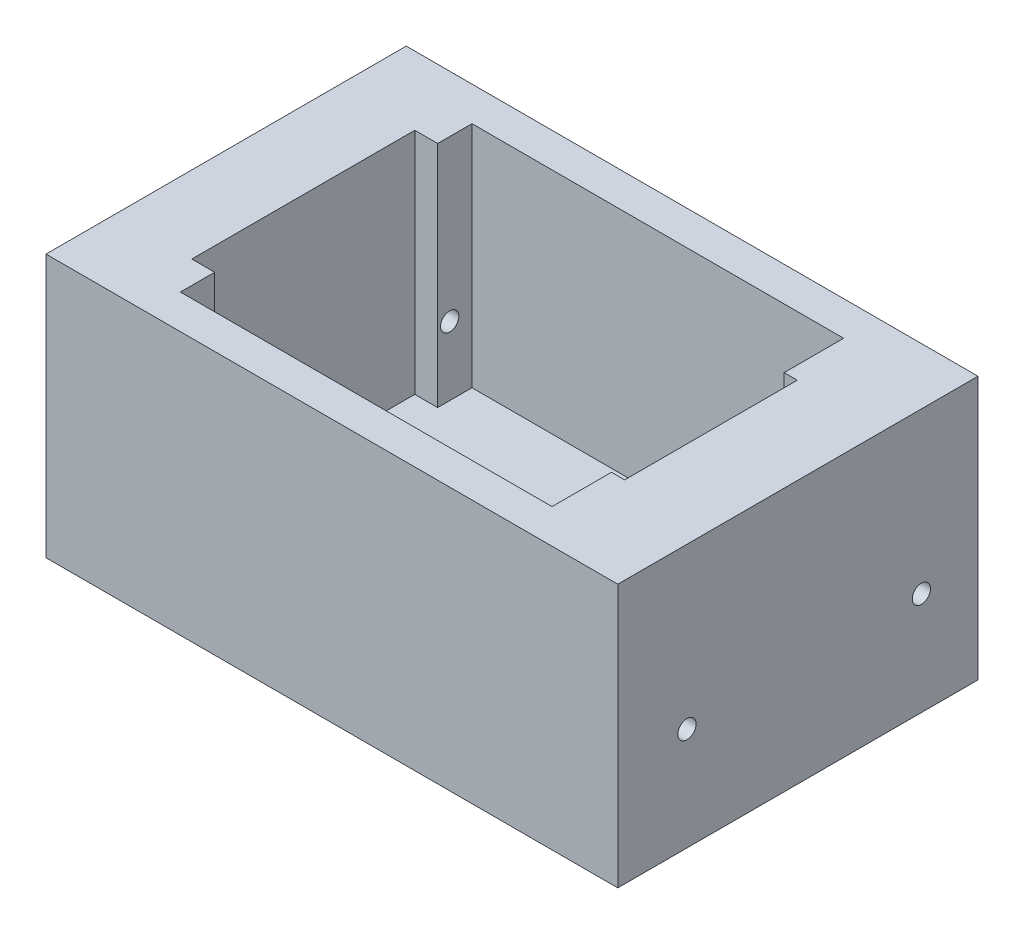
ISO-10303-21;
HEADER;
FILE_DESCRIPTION(('STEP AP214'),'2;1');
FILE_NAME('part.step','',(''),(''),'','','');
FILE_SCHEMA(('AUTOMOTIVE_DESIGN { 1 0 10303 214 1 1 1 1 }'));
ENDSEC;
DATA;
#1=APPLICATION_CONTEXT('core data for automotive mechanical design processes');
#2=APPLICATION_PROTOCOL_DEFINITION('international standard','automotive_design',2000,#1);
#3=PRODUCT_CONTEXT('',#1,'mechanical');
#4=PRODUCT('Part','Part','',(#3));
#5=PRODUCT_RELATED_PRODUCT_CATEGORY('part','',(#4));
#6=PRODUCT_DEFINITION_FORMATION('','',#4);
#7=PRODUCT_DEFINITION_CONTEXT('part definition',#1,'design');
#8=PRODUCT_DEFINITION('design','',#6,#7);
#9=PRODUCT_DEFINITION_SHAPE('','',#8);
#10=(LENGTH_UNIT() NAMED_UNIT(*) SI_UNIT(.MILLI.,.METRE.));
#11=(NAMED_UNIT(*) PLANE_ANGLE_UNIT() SI_UNIT($,.RADIAN.));
#12=(NAMED_UNIT(*) SI_UNIT($,.STERADIAN.) SOLID_ANGLE_UNIT());
#13=UNCERTAINTY_MEASURE_WITH_UNIT(LENGTH_MEASURE(1.E-05),#10,'distance_accuracy_value','');
#14=(GEOMETRIC_REPRESENTATION_CONTEXT(3) GLOBAL_UNCERTAINTY_ASSIGNED_CONTEXT((#13)) GLOBAL_UNIT_ASSIGNED_CONTEXT((#10,
#11,#12)) REPRESENTATION_CONTEXT('',''));
#15=CARTESIAN_POINT('',(0.,0.,0.));
#16=DIRECTION('',(0.,0.,1.));
#17=DIRECTION('',(1.,0.,0.));
#18=AXIS2_PLACEMENT_3D('',#15,#16,#17);
#19=CARTESIAN_POINT('',(6.75,3.,-6.));
#20=DIRECTION('',(0.,0.,1.));
#21=DIRECTION('',(1.,0.,0.));
#22=AXIS2_PLACEMENT_3D('',#19,#20,#21);
#23=PLANE('',#22);
#24=DIRECTION('',(1.,0.,0.));
#25=VECTOR('',#24,1.);
#26=CARTESIAN_POINT('',(0.,8.20156402886643,-5.99999999999999));
#27=LINE('',#26,#25);
#28=CARTESIAN_POINT('',(8.75000000000001,8.20156402886643,-5.99999999999999));
#29=VERTEX_POINT('',#28);
#30=CARTESIAN_POINT('',(6.75,8.20156402886643,-6.));
#31=VERTEX_POINT('',#30);
#32=EDGE_CURVE('E59',#29,#31,#27,.F.);
#33=ORIENTED_EDGE('',*,*,#32,.F.);
#34=DIRECTION('',(0.,1.,0.));
#35=VECTOR('',#34,1.);
#36=CARTESIAN_POINT('',(8.75000000000001,3.,-6.));
#37=LINE('',#36,#35);
#38=CARTESIAN_POINT('',(8.75000000000001,3.,-6.));
#39=VERTEX_POINT('',#38);
#40=EDGE_CURVE('E196',#39,#29,#37,.T.);
#41=ORIENTED_EDGE('',*,*,#40,.F.);
#42=DIRECTION('',(1.,0.,0.));
#43=VECTOR('',#42,1.);
#44=CARTESIAN_POINT('',(6.75,3.,-6.));
#45=LINE('',#44,#43);
#46=CARTESIAN_POINT('',(6.75,3.,-6.));
#47=VERTEX_POINT('',#46);
#48=EDGE_CURVE('E329',#47,#39,#45,.T.);
#49=ORIENTED_EDGE('',*,*,#48,.F.);
#50=DIRECTION('',(0.,1.,0.));
#51=VECTOR('',#50,1.);
#52=CARTESIAN_POINT('',(6.75,3.,-6.));
#53=LINE('',#52,#51);
#54=EDGE_CURVE('E188',#47,#31,#53,.T.);
#55=ORIENTED_EDGE('',*,*,#54,.T.);
#56=EDGE_LOOP('',(#33,#41,#49,#55));
#57=FACE_BOUND('',#56,.T.);
#58=ADVANCED_FACE('F43',(#57),#23,.F.);
#59=DIRECTION('',(1.,0.,0.));
#60=VECTOR('',#59,1.);
#61=CARTESIAN_POINT('',(0.,9.79843597113357,-5.99999999999999));
#62=LINE('',#61,#60);
#63=CARTESIAN_POINT('',(6.75,9.79843597113357,-6.));
#64=VERTEX_POINT('',#63);
#65=CARTESIAN_POINT('',(8.75000000000001,9.79843597113357,-5.99999999999999));
#66=VERTEX_POINT('',#65);
#67=EDGE_CURVE('E168',#64,#66,#62,.T.);
#68=ORIENTED_EDGE('',*,*,#67,.F.);
#69=CARTESIAN_POINT('',(6.75,23.,-6.));
#70=VERTEX_POINT('',#69);
#71=EDGE_CURVE('E177',#64,#70,#53,.T.);
#72=ORIENTED_EDGE('',*,*,#71,.T.);
#73=DIRECTION('',(1.,0.,0.));
#74=VECTOR('',#73,1.);
#75=CARTESIAN_POINT('',(6.75,23.,-6.));
#76=LINE('',#75,#74);
#77=CARTESIAN_POINT('',(8.75000000000001,23.,-6.));
#78=VERTEX_POINT('',#77);
#79=EDGE_CURVE('E369',#70,#78,#76,.T.);
#80=ORIENTED_EDGE('',*,*,#79,.T.);
#81=EDGE_CURVE('E179',#66,#78,#37,.T.);
#82=ORIENTED_EDGE('',*,*,#81,.F.);
#83=EDGE_LOOP('',(#68,#72,#80,#82));
#84=FACE_BOUND('',#83,.T.);
#85=ADVANCED_FACE('F175',(#84),#23,.F.);
#86=CARTESIAN_POINT('',(0.,23.,0.));
#87=DIRECTION('',(1.,0.,0.));
#88=DIRECTION('',(0.,0.,-1.));
#89=AXIS2_PLACEMENT_3D('',#86,#87,#88);
#90=PLANE('',#89);
#91=CARTESIAN_POINT('',(0.,9.,-26.55));
#92=DIRECTION('',(-1.,0.,0.));
#93=DIRECTION('',(0.,0.,1.));
#94=AXIS2_PLACEMENT_3D('',#91,#92,#93);
#95=CIRCLE('',#94,0.799999999999999);
#96=CARTESIAN_POINT('',(0.,9.,-25.75));
#97=VERTEX_POINT('',#96);
#98=EDGE_CURVE('E181',#97,#97,#95,.T.);
#99=ORIENTED_EDGE('',*,*,#98,.F.);
#100=EDGE_LOOP('',(#99));
#101=FACE_BOUND('',#100,.T.);
#102=CARTESIAN_POINT('',(0.,9.,-6.05));
#103=DIRECTION('',(-1.,0.,0.));
#104=DIRECTION('',(0.,0.,1.));
#105=AXIS2_PLACEMENT_3D('',#102,#103,#104);
#106=CIRCLE('',#105,0.800000000000001);
#107=CARTESIAN_POINT('',(0.,9.,-5.25));
#108=VERTEX_POINT('',#107);
#109=EDGE_CURVE('E448',#108,#108,#106,.T.);
#110=ORIENTED_EDGE('',*,*,#109,.F.);
#111=EDGE_LOOP('',(#110));
#112=FACE_BOUND('',#111,.T.);
#113=DIRECTION('',(0.,0.,1.));
#114=VECTOR('',#113,1.);
#115=CARTESIAN_POINT('',(0.,0.,0.));
#116=LINE('',#115,#114);
#117=CARTESIAN_POINT('',(0.,0.,-31.5));
#118=VERTEX_POINT('',#117);
#119=CARTESIAN_POINT('',(0.,0.,0.));
#120=VERTEX_POINT('',#119);
#121=EDGE_CURVE('E217',#118,#120,#116,.T.);
#122=ORIENTED_EDGE('',*,*,#121,.T.);
#123=DIRECTION('',(0.,-1.,0.));
#124=VECTOR('',#123,1.);
#125=CARTESIAN_POINT('',(0.,23.,0.));
#126=LINE('',#125,#124);
#127=CARTESIAN_POINT('',(0.,23.,0.));
#128=VERTEX_POINT('',#127);
#129=EDGE_CURVE('E53',#128,#120,#126,.T.);
#130=ORIENTED_EDGE('',*,*,#129,.F.);
#131=DIRECTION('',(0.,0.,1.));
#132=VECTOR('',#131,1.);
#133=CARTESIAN_POINT('',(0.,23.,0.));
#134=LINE('',#133,#132);
#135=CARTESIAN_POINT('',(0.,23.,-31.5));
#136=VERTEX_POINT('',#135);
#137=EDGE_CURVE('E202',#136,#128,#134,.T.);
#138=ORIENTED_EDGE('',*,*,#137,.F.);
#139=DIRECTION('',(0.,-1.,0.));
#140=VECTOR('',#139,1.);
#141=CARTESIAN_POINT('',(0.,23.,-31.5));
#142=LINE('',#141,#140);
#143=EDGE_CURVE('E216',#136,#118,#142,.T.);
#144=ORIENTED_EDGE('',*,*,#143,.T.);
#145=EDGE_LOOP('',(#122,#130,#138,#144));
#146=FACE_BOUND('',#145,.T.);
#147=ADVANCED_FACE('F45',(#101,#112,#146),#90,.F.);
#148=CARTESIAN_POINT('',(0.,23.,0.));
#149=DIRECTION('',(0.,0.,-1.));
#150=DIRECTION('',(-1.,0.,0.));
#151=AXIS2_PLACEMENT_3D('',#148,#149,#150);
#152=PLANE('',#151);
#153=DIRECTION('',(1.,0.,0.));
#154=VECTOR('',#153,1.);
#155=CARTESIAN_POINT('',(0.,0.,0.));
#156=LINE('',#155,#154);
#157=CARTESIAN_POINT('',(50.,0.,0.));
#158=VERTEX_POINT('',#157);
#159=EDGE_CURVE('E221',#120,#158,#156,.T.);
#160=ORIENTED_EDGE('',*,*,#159,.T.);
#161=DIRECTION('',(0.,-1.,0.));
#162=VECTOR('',#161,1.);
#163=CARTESIAN_POINT('',(50.,23.,0.));
#164=LINE('',#163,#162);
#165=CARTESIAN_POINT('',(50.,23.,0.));
#166=VERTEX_POINT('',#165);
#167=EDGE_CURVE('E237',#166,#158,#164,.T.);
#168=ORIENTED_EDGE('',*,*,#167,.F.);
#169=DIRECTION('',(1.,0.,0.));
#170=VECTOR('',#169,1.);
#171=CARTESIAN_POINT('',(0.,23.,0.));
#172=LINE('',#171,#170);
#173=EDGE_CURVE('E206',#128,#166,#172,.T.);
#174=ORIENTED_EDGE('',*,*,#173,.F.);
#175=ORIENTED_EDGE('',*,*,#129,.T.);
#176=EDGE_LOOP('',(#160,#168,#174,#175));
#177=FACE_BOUND('',#176,.T.);
#178=ADVANCED_FACE('F245',(#177),#152,.F.);
#179=CARTESIAN_POINT('',(50.,23.,0.));
#180=DIRECTION('',(-1.,0.,0.));
#181=DIRECTION('',(0.,0.,1.));
#182=AXIS2_PLACEMENT_3D('',#179,#180,#181);
#183=PLANE('',#182);
#184=CARTESIAN_POINT('',(50.,9.,-26.55));
#185=DIRECTION('',(-1.,0.,0.));
#186=DIRECTION('',(0.,0.,1.));
#187=AXIS2_PLACEMENT_3D('',#184,#185,#186);
#188=CIRCLE('',#187,0.799999999999999);
#189=CARTESIAN_POINT('',(50.,9.,-25.75));
#190=VERTEX_POINT('',#189);
#191=EDGE_CURVE('E452',#190,#190,#188,.T.);
#192=ORIENTED_EDGE('',*,*,#191,.T.);
#193=EDGE_LOOP('',(#192));
#194=FACE_BOUND('',#193,.T.);
#195=CARTESIAN_POINT('',(50.,9.,-6.05));
#196=DIRECTION('',(-1.,0.,0.));
#197=DIRECTION('',(0.,0.,1.));
#198=AXIS2_PLACEMENT_3D('',#195,#196,#197);
#199=CIRCLE('',#198,0.800000000000001);
#200=CARTESIAN_POINT('',(50.,9.,-5.25));
#201=VERTEX_POINT('',#200);
#202=EDGE_CURVE('E453',#201,#201,#199,.T.);
#203=ORIENTED_EDGE('',*,*,#202,.T.);
#204=EDGE_LOOP('',(#203));
#205=FACE_BOUND('',#204,.T.);
#206=DIRECTION('',(0.,0.,-1.));
#207=VECTOR('',#206,1.);
#208=CARTESIAN_POINT('',(50.,0.,0.));
#209=LINE('',#208,#207);
#210=CARTESIAN_POINT('',(50.,0.,-31.5));
#211=VERTEX_POINT('',#210);
#212=EDGE_CURVE('E225',#158,#211,#209,.T.);
#213=ORIENTED_EDGE('',*,*,#212,.T.);
#214=DIRECTION('',(0.,-1.,0.));
#215=VECTOR('',#214,1.);
#216=CARTESIAN_POINT('',(50.,23.,-31.5));
#217=LINE('',#216,#215);
#218=CARTESIAN_POINT('',(50.,23.,-31.5));
#219=VERTEX_POINT('',#218);
#220=EDGE_CURVE('E233',#219,#211,#217,.T.);
#221=ORIENTED_EDGE('',*,*,#220,.F.);
#222=DIRECTION('',(0.,0.,-1.));
#223=VECTOR('',#222,1.);
#224=CARTESIAN_POINT('',(50.,23.,0.));
#225=LINE('',#224,#223);
#226=EDGE_CURVE('E210',#166,#219,#225,.T.);
#227=ORIENTED_EDGE('',*,*,#226,.F.);
#228=ORIENTED_EDGE('',*,*,#167,.T.);
#229=EDGE_LOOP('',(#213,#221,#227,#228));
#230=FACE_BOUND('',#229,.T.);
#231=ADVANCED_FACE('F257',(#194,#205,#230),#183,.F.);
#232=CARTESIAN_POINT('',(0.,23.,-31.5));
#233=DIRECTION('',(0.,0.,1.));
#234=DIRECTION('',(1.,0.,0.));
#235=AXIS2_PLACEMENT_3D('',#232,#233,#234);
#236=PLANE('',#235);
#237=DIRECTION('',(-1.,0.,0.));
#238=VECTOR('',#237,1.);
#239=CARTESIAN_POINT('',(0.,0.,-31.5));
#240=LINE('',#239,#238);
#241=EDGE_CURVE('E207',#211,#118,#240,.T.);
#242=ORIENTED_EDGE('',*,*,#241,.T.);
#243=ORIENTED_EDGE('',*,*,#143,.F.);
#244=DIRECTION('',(-1.,0.,0.));
#245=VECTOR('',#244,1.);
#246=CARTESIAN_POINT('',(0.,23.,-31.5));
#247=LINE('',#246,#245);
#248=EDGE_CURVE('E213',#219,#136,#247,.T.);
#249=ORIENTED_EDGE('',*,*,#248,.F.);
#250=ORIENTED_EDGE('',*,*,#220,.T.);
#251=EDGE_LOOP('',(#242,#243,#249,#250));
#252=FACE_BOUND('',#251,.T.);
#253=ADVANCED_FACE('F261',(#252),#236,.F.);
#254=CARTESIAN_POINT('',(0.,23.,0.));
#255=DIRECTION('',(0.,-1.,0.));
#256=DIRECTION('',(0.,0.,-1.));
#257=AXIS2_PLACEMENT_3D('',#254,#255,#256);
#258=PLANE('',#257);
#259=DIRECTION('',(-1.,0.,0.));
#260=VECTOR('',#259,1.);
#261=CARTESIAN_POINT('',(8.75,23.,-25.5));
#262=LINE('',#261,#260);
#263=CARTESIAN_POINT('',(8.75,23.,-25.5));
#264=VERTEX_POINT('',#263);
#265=CARTESIAN_POINT('',(6.75,23.,-25.5));
#266=VERTEX_POINT('',#265);
#267=EDGE_CURVE('E309',#264,#266,#262,.T.);
#268=ORIENTED_EDGE('',*,*,#267,.F.);
#269=DIRECTION('',(0.,0.,1.));
#270=VECTOR('',#269,1.);
#271=CARTESIAN_POINT('',(8.75,23.,-28.5));
#272=LINE('',#271,#270);
#273=CARTESIAN_POINT('',(8.75,23.,-28.5));
#274=VERTEX_POINT('',#273);
#275=EDGE_CURVE('E67',#274,#264,#272,.T.);
#276=ORIENTED_EDGE('',*,*,#275,.F.);
#277=DIRECTION('',(-1.,0.,0.));
#278=VECTOR('',#277,1.);
#279=CARTESIAN_POINT('',(41.25,23.,-28.5));
#280=LINE('',#279,#278);
#281=CARTESIAN_POINT('',(41.25,23.,-28.5));
#282=VERTEX_POINT('',#281);
#283=EDGE_CURVE('E321',#282,#274,#280,.T.);
#284=ORIENTED_EDGE('',*,*,#283,.F.);
#285=DIRECTION('',(0.,0.,-1.));
#286=VECTOR('',#285,1.);
#287=CARTESIAN_POINT('',(41.25,23.,-23.3));
#288=LINE('',#287,#286);
#289=CARTESIAN_POINT('',(41.25,23.,-23.3));
#290=VERTEX_POINT('',#289);
#291=EDGE_CURVE('E396',#290,#282,#288,.T.);
#292=ORIENTED_EDGE('',*,*,#291,.F.);
#293=DIRECTION('',(-1.,0.,0.));
#294=VECTOR('',#293,1.);
#295=CARTESIAN_POINT('',(42.4,23.,-23.3));
#296=LINE('',#295,#294);
#297=CARTESIAN_POINT('',(42.4,23.,-23.3));
#298=VERTEX_POINT('',#297);
#299=EDGE_CURVE('E392',#298,#290,#296,.T.);
#300=ORIENTED_EDGE('',*,*,#299,.F.);
#301=DIRECTION('',(0.,0.,-1.));
#302=VECTOR('',#301,1.);
#303=CARTESIAN_POINT('',(42.4,23.,-8.2));
#304=LINE('',#303,#302);
#305=CARTESIAN_POINT('',(42.4,23.,-8.2));
#306=VERTEX_POINT('',#305);
#307=EDGE_CURVE('E388',#306,#298,#304,.T.);
#308=ORIENTED_EDGE('',*,*,#307,.F.);
#309=DIRECTION('',(1.,0.,0.));
#310=VECTOR('',#309,1.);
#311=CARTESIAN_POINT('',(41.25,23.,-8.2));
#312=LINE('',#311,#310);
#313=CARTESIAN_POINT('',(41.25,23.,-8.2));
#314=VERTEX_POINT('',#313);
#315=EDGE_CURVE('E384',#314,#306,#312,.T.);
#316=ORIENTED_EDGE('',*,*,#315,.F.);
#317=DIRECTION('',(0.,0.,-1.));
#318=VECTOR('',#317,1.);
#319=CARTESIAN_POINT('',(41.25,23.,-3.));
#320=LINE('',#319,#318);
#321=CARTESIAN_POINT('',(41.25,23.,-3.));
#322=VERTEX_POINT('',#321);
#323=EDGE_CURVE('E380',#322,#314,#320,.T.);
#324=ORIENTED_EDGE('',*,*,#323,.F.);
#325=DIRECTION('',(1.,0.,0.));
#326=VECTOR('',#325,1.);
#327=CARTESIAN_POINT('',(8.75000000000001,23.,-3.));
#328=LINE('',#327,#326);
#329=CARTESIAN_POINT('',(8.75000000000001,23.,-3.));
#330=VERTEX_POINT('',#329);
#331=EDGE_CURVE('E376',#330,#322,#328,.T.);
#332=ORIENTED_EDGE('',*,*,#331,.F.);
#333=DIRECTION('',(0.,0.,1.));
#334=VECTOR('',#333,1.);
#335=CARTESIAN_POINT('',(8.75000000000001,23.,-6.));
#336=LINE('',#335,#334);
#337=EDGE_CURVE('E372',#78,#330,#336,.T.);
#338=ORIENTED_EDGE('',*,*,#337,.F.);
#339=ORIENTED_EDGE('',*,*,#79,.F.);
#340=DIRECTION('',(0.,0.,1.));
#341=VECTOR('',#340,1.);
#342=CARTESIAN_POINT('',(6.75,23.,-25.5));
#343=LINE('',#342,#341);
#344=EDGE_CURVE('E185',#266,#70,#343,.T.);
#345=ORIENTED_EDGE('',*,*,#344,.F.);
#346=EDGE_LOOP('',(#268,#276,#284,#292,#300,#308,#316,#324,#332,#338,#339,#345));
#347=FACE_BOUND('',#346,.T.);
#348=ORIENTED_EDGE('',*,*,#137,.T.);
#349=ORIENTED_EDGE('',*,*,#173,.T.);
#350=ORIENTED_EDGE('',*,*,#226,.T.);
#351=ORIENTED_EDGE('',*,*,#248,.T.);
#352=EDGE_LOOP('',(#348,#349,#350,#351));
#353=FACE_BOUND('',#352,.T.);
#354=ADVANCED_FACE('F263',(#347,#353),#258,.F.);
#355=CARTESIAN_POINT('',(0.,0.,0.));
#356=DIRECTION('',(0.,-1.,0.));
#357=DIRECTION('',(0.,0.,-1.));
#358=AXIS2_PLACEMENT_3D('',#355,#356,#357);
#359=PLANE('',#358);
#360=ORIENTED_EDGE('',*,*,#121,.F.);
#361=ORIENTED_EDGE('',*,*,#241,.F.);
#362=ORIENTED_EDGE('',*,*,#212,.F.);
#363=ORIENTED_EDGE('',*,*,#159,.F.);
#364=EDGE_LOOP('',(#360,#361,#362,#363));
#365=FACE_BOUND('',#364,.T.);
#366=ADVANCED_FACE('F253',(#365),#359,.T.);
#367=CARTESIAN_POINT('',(8.75,3.,-28.5));
#368=DIRECTION('',(-1.,0.,0.));
#369=DIRECTION('',(0.,0.,1.));
#370=AXIS2_PLACEMENT_3D('',#367,#368,#369);
#371=PLANE('',#370);
#372=CARTESIAN_POINT('',(8.75,9.,-26.55));
#373=DIRECTION('',(-1.,0.,0.));
#374=DIRECTION('',(0.,0.,1.));
#375=AXIS2_PLACEMENT_3D('',#372,#373,#374);
#376=CIRCLE('',#375,0.799999999999999);
#377=CARTESIAN_POINT('',(8.75,9.,-25.75));
#378=VERTEX_POINT('',#377);
#379=EDGE_CURVE('E303',#378,#378,#376,.F.);
#380=ORIENTED_EDGE('',*,*,#379,.F.);
#381=EDGE_LOOP('',(#380));
#382=FACE_BOUND('',#381,.T.);
#383=ORIENTED_EDGE('',*,*,#275,.T.);
#384=DIRECTION('',(0.,1.,0.));
#385=VECTOR('',#384,1.);
#386=CARTESIAN_POINT('',(8.75,3.,-25.5));
#387=LINE('',#386,#385);
#388=CARTESIAN_POINT('',(8.75,3.,-25.5));
#389=VERTEX_POINT('',#388);
#390=EDGE_CURVE('E193',#389,#264,#387,.T.);
#391=ORIENTED_EDGE('',*,*,#390,.F.);
#392=DIRECTION('',(0.,0.,1.));
#393=VECTOR('',#392,1.);
#394=CARTESIAN_POINT('',(8.75,3.,-28.5));
#395=LINE('',#394,#393);
#396=CARTESIAN_POINT('',(8.75,3.,-28.5));
#397=VERTEX_POINT('',#396);
#398=EDGE_CURVE('E316',#397,#389,#395,.T.);
#399=ORIENTED_EDGE('',*,*,#398,.F.);
#400=DIRECTION('',(0.,1.,0.));
#401=VECTOR('',#400,1.);
#402=CARTESIAN_POINT('',(8.75,3.,-28.5));
#403=LINE('',#402,#401);
#404=EDGE_CURVE('E222',#397,#274,#403,.T.);
#405=ORIENTED_EDGE('',*,*,#404,.T.);
#406=EDGE_LOOP('',(#383,#391,#399,#405));
#407=FACE_BOUND('',#406,.T.);
#408=ADVANCED_FACE('F271',(#382,#407),#371,.F.);
#409=CARTESIAN_POINT('',(41.25,3.,-28.5));
#410=DIRECTION('',(0.,0.,-1.));
#411=DIRECTION('',(-1.,0.,0.));
#412=AXIS2_PLACEMENT_3D('',#409,#410,#411);
#413=PLANE('',#412);
#414=ORIENTED_EDGE('',*,*,#283,.T.);
#415=ORIENTED_EDGE('',*,*,#404,.F.);
#416=DIRECTION('',(-1.,0.,0.));
#417=VECTOR('',#416,1.);
#418=CARTESIAN_POINT('',(41.25,3.,-28.5));
#419=LINE('',#418,#417);
#420=CARTESIAN_POINT('',(41.25,3.,-28.5));
#421=VERTEX_POINT('',#420);
#422=EDGE_CURVE('E201',#421,#397,#419,.T.);
#423=ORIENTED_EDGE('',*,*,#422,.F.);
#424=DIRECTION('',(0.,1.,0.));
#425=VECTOR('',#424,1.);
#426=CARTESIAN_POINT('',(41.25,3.,-28.5));
#427=LINE('',#426,#425);
#428=EDGE_CURVE('E405',#421,#282,#427,.T.);
#429=ORIENTED_EDGE('',*,*,#428,.T.);
#430=EDGE_LOOP('',(#414,#415,#423,#429));
#431=FACE_BOUND('',#430,.T.);
#432=ADVANCED_FACE('F293',(#431),#413,.F.);
#433=CARTESIAN_POINT('',(41.25,3.,-23.3));
#434=DIRECTION('',(1.,0.,0.));
#435=DIRECTION('',(0.,0.,-1.));
#436=AXIS2_PLACEMENT_3D('',#433,#434,#435);
#437=PLANE('',#436);
#438=CARTESIAN_POINT('',(41.25,9.,-26.55));
#439=DIRECTION('',(1.,0.,0.));
#440=DIRECTION('',(0.,0.,-1.));
#441=AXIS2_PLACEMENT_3D('',#438,#439,#440);
#442=CIRCLE('',#441,0.799999999999999);
#443=CARTESIAN_POINT('',(41.25,9.,-27.35));
#444=VERTEX_POINT('',#443);
#445=EDGE_CURVE('E47',#444,#444,#442,.F.);
#446=ORIENTED_EDGE('',*,*,#445,.F.);
#447=EDGE_LOOP('',(#446));
#448=FACE_BOUND('',#447,.T.);
#449=ORIENTED_EDGE('',*,*,#291,.T.);
#450=ORIENTED_EDGE('',*,*,#428,.F.);
#451=DIRECTION('',(0.,0.,-1.));
#452=VECTOR('',#451,1.);
#453=CARTESIAN_POINT('',(41.25,3.,-23.3));
#454=LINE('',#453,#452);
#455=CARTESIAN_POINT('',(41.25,3.,-23.3));
#456=VERTEX_POINT('',#455);
#457=EDGE_CURVE('E357',#456,#421,#454,.T.);
#458=ORIENTED_EDGE('',*,*,#457,.F.);
#459=DIRECTION('',(0.,1.,0.));
#460=VECTOR('',#459,1.);
#461=CARTESIAN_POINT('',(41.25,3.,-23.3));
#462=LINE('',#461,#460);
#463=EDGE_CURVE('E408',#456,#290,#462,.T.);
#464=ORIENTED_EDGE('',*,*,#463,.T.);
#465=EDGE_LOOP('',(#449,#450,#458,#464));
#466=FACE_BOUND('',#465,.T.);
#467=ADVANCED_FACE('F298',(#448,#466),#437,.F.);
#468=CARTESIAN_POINT('',(42.4,3.,-23.3));
#469=DIRECTION('',(0.,0.,-1.));
#470=DIRECTION('',(-1.,0.,0.));
#471=AXIS2_PLACEMENT_3D('',#468,#469,#470);
#472=PLANE('',#471);
#473=ORIENTED_EDGE('',*,*,#299,.T.);
#474=ORIENTED_EDGE('',*,*,#463,.F.);
#475=DIRECTION('',(-1.,0.,0.));
#476=VECTOR('',#475,1.);
#477=CARTESIAN_POINT('',(42.4,3.,-23.3));
#478=LINE('',#477,#476);
#479=CARTESIAN_POINT('',(42.4,3.,-23.3));
#480=VERTEX_POINT('',#479);
#481=EDGE_CURVE('E353',#480,#456,#478,.T.);
#482=ORIENTED_EDGE('',*,*,#481,.F.);
#483=DIRECTION('',(0.,1.,0.));
#484=VECTOR('',#483,1.);
#485=CARTESIAN_POINT('',(42.4,3.,-23.3));
#486=LINE('',#485,#484);
#487=EDGE_CURVE('E411',#480,#298,#486,.T.);
#488=ORIENTED_EDGE('',*,*,#487,.T.);
#489=EDGE_LOOP('',(#473,#474,#482,#488));
#490=FACE_BOUND('',#489,.T.);
#491=ADVANCED_FACE('F476',(#490),#472,.F.);
#492=CARTESIAN_POINT('',(42.4,3.,-8.2));
#493=DIRECTION('',(1.,0.,0.));
#494=DIRECTION('',(0.,0.,-1.));
#495=AXIS2_PLACEMENT_3D('',#492,#493,#494);
#496=PLANE('',#495);
#497=ORIENTED_EDGE('',*,*,#307,.T.);
#498=ORIENTED_EDGE('',*,*,#487,.F.);
#499=DIRECTION('',(0.,0.,-1.));
#500=VECTOR('',#499,1.);
#501=CARTESIAN_POINT('',(42.4,3.,-8.2));
#502=LINE('',#501,#500);
#503=CARTESIAN_POINT('',(42.4,3.,-8.2));
#504=VERTEX_POINT('',#503);
#505=EDGE_CURVE('E349',#504,#480,#502,.T.);
#506=ORIENTED_EDGE('',*,*,#505,.F.);
#507=DIRECTION('',(0.,1.,0.));
#508=VECTOR('',#507,1.);
#509=CARTESIAN_POINT('',(42.4,3.,-8.2));
#510=LINE('',#509,#508);
#511=EDGE_CURVE('E414',#504,#306,#510,.T.);
#512=ORIENTED_EDGE('',*,*,#511,.T.);
#513=EDGE_LOOP('',(#497,#498,#506,#512));
#514=FACE_BOUND('',#513,.T.);
#515=ADVANCED_FACE('F489',(#514),#496,.F.);
#516=CARTESIAN_POINT('',(41.25,3.,-8.2));
#517=DIRECTION('',(0.,0.,1.));
#518=DIRECTION('',(1.,0.,0.));
#519=AXIS2_PLACEMENT_3D('',#516,#517,#518);
#520=PLANE('',#519);
#521=ORIENTED_EDGE('',*,*,#315,.T.);
#522=ORIENTED_EDGE('',*,*,#511,.F.);
#523=DIRECTION('',(1.,0.,0.));
#524=VECTOR('',#523,1.);
#525=CARTESIAN_POINT('',(41.25,3.,-8.2));
#526=LINE('',#525,#524);
#527=CARTESIAN_POINT('',(41.25,3.,-8.2));
#528=VERTEX_POINT('',#527);
#529=EDGE_CURVE('E345',#528,#504,#526,.T.);
#530=ORIENTED_EDGE('',*,*,#529,.F.);
#531=DIRECTION('',(0.,1.,0.));
#532=VECTOR('',#531,1.);
#533=CARTESIAN_POINT('',(41.25,3.,-8.2));
#534=LINE('',#533,#532);
#535=EDGE_CURVE('E417',#528,#314,#534,.T.);
#536=ORIENTED_EDGE('',*,*,#535,.T.);
#537=EDGE_LOOP('',(#521,#522,#530,#536));
#538=FACE_BOUND('',#537,.T.);
#539=ADVANCED_FACE('F491',(#538),#520,.F.);
#540=CARTESIAN_POINT('',(41.25,3.,-3.));
#541=DIRECTION('',(1.,0.,0.));
#542=DIRECTION('',(0.,0.,-1.));
#543=AXIS2_PLACEMENT_3D('',#540,#541,#542);
#544=PLANE('',#543);
#545=CARTESIAN_POINT('',(41.25,9.,-6.05));
#546=DIRECTION('',(1.,0.,0.));
#547=DIRECTION('',(0.,0.,-1.));
#548=AXIS2_PLACEMENT_3D('',#545,#546,#547);
#549=CIRCLE('',#548,0.800000000000001);
#550=CARTESIAN_POINT('',(41.25,9.,-6.85));
#551=VERTEX_POINT('',#550);
#552=EDGE_CURVE('E312',#551,#551,#549,.F.);
#553=ORIENTED_EDGE('',*,*,#552,.F.);
#554=EDGE_LOOP('',(#553));
#555=FACE_BOUND('',#554,.T.);
#556=ORIENTED_EDGE('',*,*,#323,.T.);
#557=ORIENTED_EDGE('',*,*,#535,.F.);
#558=DIRECTION('',(0.,0.,-1.));
#559=VECTOR('',#558,1.);
#560=CARTESIAN_POINT('',(41.25,3.,-3.));
#561=LINE('',#560,#559);
#562=CARTESIAN_POINT('',(41.25,3.,-3.));
#563=VERTEX_POINT('',#562);
#564=EDGE_CURVE('E341',#563,#528,#561,.T.);
#565=ORIENTED_EDGE('',*,*,#564,.F.);
#566=DIRECTION('',(0.,1.,0.));
#567=VECTOR('',#566,1.);
#568=CARTESIAN_POINT('',(41.25,3.,-3.));
#569=LINE('',#568,#567);
#570=EDGE_CURVE('E420',#563,#322,#569,.T.);
#571=ORIENTED_EDGE('',*,*,#570,.T.);
#572=EDGE_LOOP('',(#556,#557,#565,#571));
#573=FACE_BOUND('',#572,.T.);
#574=ADVANCED_FACE('F439',(#555,#573),#544,.F.);
#575=CARTESIAN_POINT('',(8.75000000000001,3.,-3.));
#576=DIRECTION('',(0.,0.,1.));
#577=DIRECTION('',(1.,0.,0.));
#578=AXIS2_PLACEMENT_3D('',#575,#576,#577);
#579=PLANE('',#578);
#580=ORIENTED_EDGE('',*,*,#331,.T.);
#581=ORIENTED_EDGE('',*,*,#570,.F.);
#582=DIRECTION('',(1.,0.,0.));
#583=VECTOR('',#582,1.);
#584=CARTESIAN_POINT('',(8.75000000000001,3.,-3.));
#585=LINE('',#584,#583);
#586=CARTESIAN_POINT('',(8.75000000000001,3.,-3.));
#587=VERTEX_POINT('',#586);
#588=EDGE_CURVE('E337',#587,#563,#585,.T.);
#589=ORIENTED_EDGE('',*,*,#588,.F.);
#590=DIRECTION('',(0.,1.,0.));
#591=VECTOR('',#590,1.);
#592=CARTESIAN_POINT('',(8.75000000000001,3.,-3.));
#593=LINE('',#592,#591);
#594=EDGE_CURVE('E422',#587,#330,#593,.T.);
#595=ORIENTED_EDGE('',*,*,#594,.T.);
#596=EDGE_LOOP('',(#580,#581,#589,#595));
#597=FACE_BOUND('',#596,.T.);
#598=ADVANCED_FACE('F436',(#597),#579,.F.);
#599=CARTESIAN_POINT('',(8.75000000000001,3.,-6.));
#600=DIRECTION('',(-1.,0.,0.));
#601=DIRECTION('',(0.,0.,1.));
#602=AXIS2_PLACEMENT_3D('',#599,#600,#601);
#603=PLANE('',#602);
#604=CARTESIAN_POINT('',(8.75000000000001,9.,-6.05));
#605=DIRECTION('',(-1.,0.,0.));
#606=DIRECTION('',(0.,0.,1.));
#607=AXIS2_PLACEMENT_3D('',#604,#605,#606);
#608=CIRCLE('',#607,0.800000000000001);
#609=EDGE_CURVE('E433',#66,#29,#608,.F.);
#610=ORIENTED_EDGE('',*,*,#609,.F.);
#611=ORIENTED_EDGE('',*,*,#81,.T.);
#612=ORIENTED_EDGE('',*,*,#337,.T.);
#613=ORIENTED_EDGE('',*,*,#594,.F.);
#614=DIRECTION('',(0.,0.,1.));
#615=VECTOR('',#614,1.);
#616=CARTESIAN_POINT('',(8.75000000000001,3.,-6.));
#617=LINE('',#616,#615);
#618=EDGE_CURVE('E333',#39,#587,#617,.T.);
#619=ORIENTED_EDGE('',*,*,#618,.F.);
#620=ORIENTED_EDGE('',*,*,#40,.T.);
#621=EDGE_LOOP('',(#610,#611,#612,#613,#619,#620));
#622=FACE_BOUND('',#621,.T.);
#623=ADVANCED_FACE('F284',(#622),#603,.F.);
#624=CARTESIAN_POINT('',(6.75,3.,-25.5));
#625=DIRECTION('',(-1.,0.,0.));
#626=DIRECTION('',(0.,0.,1.));
#627=AXIS2_PLACEMENT_3D('',#624,#625,#626);
#628=PLANE('',#627);
#629=CARTESIAN_POINT('',(6.75,9.,-6.05));
#630=DIRECTION('',(-1.,0.,0.));
#631=DIRECTION('',(0.,0.,1.));
#632=AXIS2_PLACEMENT_3D('',#629,#630,#631);
#633=CIRCLE('',#632,0.800000000000001);
#634=EDGE_CURVE('E11',#31,#64,#633,.F.);
#635=ORIENTED_EDGE('',*,*,#634,.F.);
#636=ORIENTED_EDGE('',*,*,#54,.F.);
#637=DIRECTION('',(0.,0.,1.));
#638=VECTOR('',#637,1.);
#639=CARTESIAN_POINT('',(6.75,3.,-25.5));
#640=LINE('',#639,#638);
#641=CARTESIAN_POINT('',(6.75,3.,-25.5));
#642=VERTEX_POINT('',#641);
#643=EDGE_CURVE('E325',#642,#47,#640,.T.);
#644=ORIENTED_EDGE('',*,*,#643,.F.);
#645=DIRECTION('',(0.,1.,0.));
#646=VECTOR('',#645,1.);
#647=CARTESIAN_POINT('',(6.75,3.,-25.5));
#648=LINE('',#647,#646);
#649=EDGE_CURVE('E189',#642,#266,#648,.T.);
#650=ORIENTED_EDGE('',*,*,#649,.T.);
#651=ORIENTED_EDGE('',*,*,#344,.T.);
#652=ORIENTED_EDGE('',*,*,#71,.F.);
#653=EDGE_LOOP('',(#635,#636,#644,#650,#651,#652));
#654=FACE_BOUND('',#653,.T.);
#655=ADVANCED_FACE('F183',(#654),#628,.F.);
#656=CARTESIAN_POINT('',(8.75,3.,-25.5));
#657=DIRECTION('',(0.,0.,-1.));
#658=DIRECTION('',(-1.,0.,0.));
#659=AXIS2_PLACEMENT_3D('',#656,#657,#658);
#660=PLANE('',#659);
#661=ORIENTED_EDGE('',*,*,#267,.T.);
#662=ORIENTED_EDGE('',*,*,#649,.F.);
#663=DIRECTION('',(-1.,0.,0.));
#664=VECTOR('',#663,1.);
#665=CARTESIAN_POINT('',(8.75,3.,-25.5));
#666=LINE('',#665,#664);
#667=EDGE_CURVE('E320',#389,#642,#666,.T.);
#668=ORIENTED_EDGE('',*,*,#667,.F.);
#669=ORIENTED_EDGE('',*,*,#390,.T.);
#670=EDGE_LOOP('',(#661,#662,#668,#669));
#671=FACE_BOUND('',#670,.T.);
#672=ADVANCED_FACE('F288',(#671),#660,.F.);
#673=CARTESIAN_POINT('',(0.,3.,0.));
#674=DIRECTION('',(0.,-1.,0.));
#675=DIRECTION('',(0.,0.,-1.));
#676=AXIS2_PLACEMENT_3D('',#673,#674,#675);
#677=PLANE('',#676);
#678=ORIENTED_EDGE('',*,*,#398,.T.);
#679=ORIENTED_EDGE('',*,*,#667,.T.);
#680=ORIENTED_EDGE('',*,*,#643,.T.);
#681=ORIENTED_EDGE('',*,*,#48,.T.);
#682=ORIENTED_EDGE('',*,*,#618,.T.);
#683=ORIENTED_EDGE('',*,*,#588,.T.);
#684=ORIENTED_EDGE('',*,*,#564,.T.);
#685=ORIENTED_EDGE('',*,*,#529,.T.);
#686=ORIENTED_EDGE('',*,*,#505,.T.);
#687=ORIENTED_EDGE('',*,*,#481,.T.);
#688=ORIENTED_EDGE('',*,*,#457,.T.);
#689=ORIENTED_EDGE('',*,*,#422,.T.);
#690=EDGE_LOOP('',(#678,#679,#680,#681,#682,#683,#684,#685,#686,#687,#688,#689));
#691=FACE_BOUND('',#690,.T.);
#692=ADVANCED_FACE('F290',(#691),#677,.F.);
#693=CARTESIAN_POINT('',(0.,9.,-6.05));
#694=DIRECTION('',(1.,0.,0.));
#695=DIRECTION('',(0.,0.,-1.));
#696=AXIS2_PLACEMENT_3D('',#693,#694,#695);
#697=CYLINDRICAL_SURFACE('',#696,0.800000000000001);
#698=ORIENTED_EDGE('',*,*,#109,.T.);
#699=EDGE_LOOP('',(#698));
#700=FACE_BOUND('',#699,.T.);
#701=ORIENTED_EDGE('',*,*,#609,.T.);
#702=ORIENTED_EDGE('',*,*,#32,.T.);
#703=ORIENTED_EDGE('',*,*,#634,.T.);
#704=ORIENTED_EDGE('',*,*,#67,.T.);
#705=EDGE_LOOP('',(#701,#702,#703,#704));
#706=FACE_BOUND('',#705,.T.);
#707=ADVANCED_FACE('F167',(#700,#706),#697,.F.);
#708=ORIENTED_EDGE('',*,*,#202,.F.);
#709=EDGE_LOOP('',(#708));
#710=FACE_BOUND('',#709,.T.);
#711=ORIENTED_EDGE('',*,*,#552,.T.);
#712=EDGE_LOOP('',(#711));
#713=FACE_BOUND('',#712,.T.);
#714=ADVANCED_FACE('F470',(#710,#713),#697,.F.);
#715=CARTESIAN_POINT('',(0.,9.,-26.55));
#716=DIRECTION('',(1.,0.,0.));
#717=DIRECTION('',(0.,0.,-1.));
#718=AXIS2_PLACEMENT_3D('',#715,#716,#717);
#719=CYLINDRICAL_SURFACE('',#718,0.799999999999999);
#720=ORIENTED_EDGE('',*,*,#191,.F.);
#721=EDGE_LOOP('',(#720));
#722=FACE_BOUND('',#721,.T.);
#723=ORIENTED_EDGE('',*,*,#445,.T.);
#724=EDGE_LOOP('',(#723));
#725=FACE_BOUND('',#724,.T.);
#726=ADVANCED_FACE('F466',(#722,#725),#719,.F.);
#727=ORIENTED_EDGE('',*,*,#98,.T.);
#728=EDGE_LOOP('',(#727));
#729=FACE_BOUND('',#728,.T.);
#730=ORIENTED_EDGE('',*,*,#379,.T.);
#731=EDGE_LOOP('',(#730));
#732=FACE_BOUND('',#731,.T.);
#733=ADVANCED_FACE('F469',(#729,#732),#719,.F.);
#734=CLOSED_SHELL('',(#58,#85,#147,#178,#231,#253,#354,#366,#408,#432,#467,#491,#515,#539,#574,
#598,#623,#655,#672,#692,#707,#714,#726,#733));
#735=MANIFOLD_SOLID_BREP('B2',#734);
#736=ADVANCED_BREP_SHAPE_REPRESENTATION('',(#18,#735),#14);
#737=SHAPE_DEFINITION_REPRESENTATION(#9,#736);
ENDSEC;
END-ISO-10303-21;
